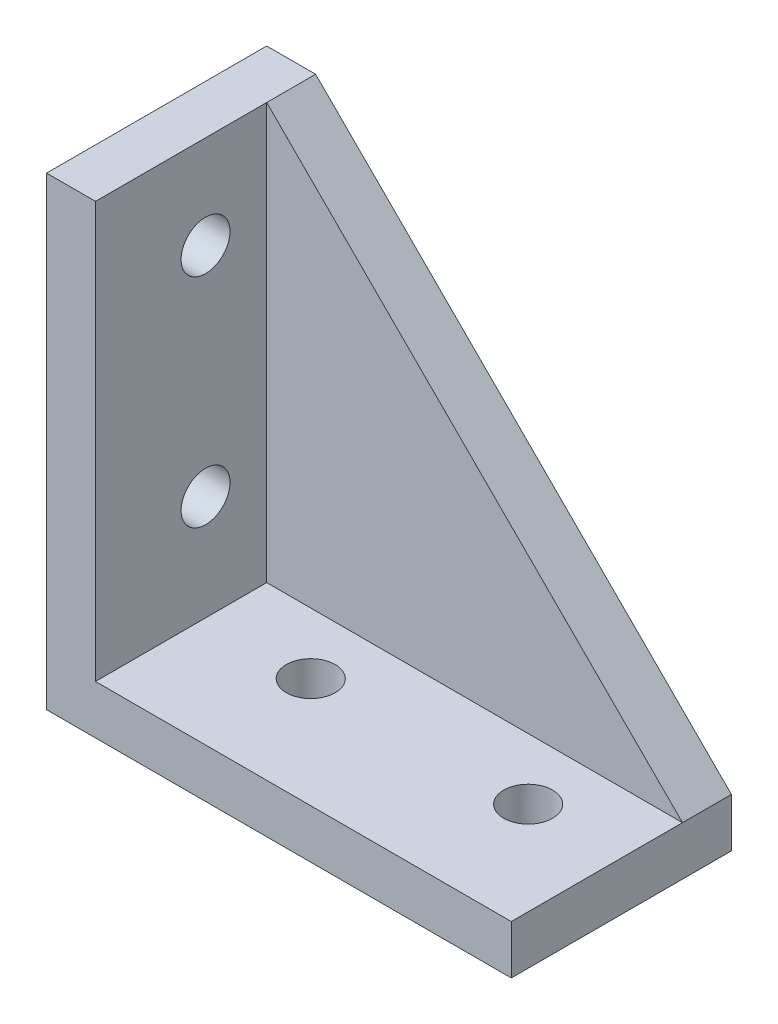
ISO-10303-21;
HEADER;
FILE_DESCRIPTION(('STEP AP214'),'2;1');
FILE_NAME('part.step','',(''),(''),'','','');
FILE_SCHEMA(('AUTOMOTIVE_DESIGN { 1 0 10303 214 1 1 1 1 }'));
ENDSEC;
DATA;
#1=APPLICATION_CONTEXT('core data for automotive mechanical design processes');
#2=APPLICATION_PROTOCOL_DEFINITION('international standard','automotive_design',2000,#1);
#3=PRODUCT_CONTEXT('',#1,'mechanical');
#4=PRODUCT('Part','Part','',(#3));
#5=PRODUCT_RELATED_PRODUCT_CATEGORY('part','',(#4));
#6=PRODUCT_DEFINITION_FORMATION('','',#4);
#7=PRODUCT_DEFINITION_CONTEXT('part definition',#1,'design');
#8=PRODUCT_DEFINITION('design','',#6,#7);
#9=PRODUCT_DEFINITION_SHAPE('','',#8);
#10=(LENGTH_UNIT() NAMED_UNIT(*) SI_UNIT(.MILLI.,.METRE.));
#11=(NAMED_UNIT(*) PLANE_ANGLE_UNIT() SI_UNIT($,.RADIAN.));
#12=(NAMED_UNIT(*) SI_UNIT($,.STERADIAN.) SOLID_ANGLE_UNIT());
#13=UNCERTAINTY_MEASURE_WITH_UNIT(LENGTH_MEASURE(1.E-05),#10,'distance_accuracy_value','');
#14=(GEOMETRIC_REPRESENTATION_CONTEXT(3) GLOBAL_UNCERTAINTY_ASSIGNED_CONTEXT((#13)) GLOBAL_UNIT_ASSIGNED_CONTEXT((#10,
#11,#12)) REPRESENTATION_CONTEXT('',''));
#15=CARTESIAN_POINT('',(0.,0.,0.));
#16=DIRECTION('',(0.,0.,1.));
#17=DIRECTION('',(1.,0.,0.));
#18=AXIS2_PLACEMENT_3D('',#15,#16,#17);
#19=CARTESIAN_POINT('',(38.,0.,14.));
#20=DIRECTION('',(0.,1.,0.));
#21=DIRECTION('',(0.,0.,1.));
#22=AXIS2_PLACEMENT_3D('',#19,#20,#21);
#23=PLANE('',#22);
#24=CARTESIAN_POINT('',(12.6,-1.31494815036604E-13,5.));
#25=DIRECTION('',(0.,-1.,0.));
#26=DIRECTION('',(0.,0.,-1.));
#27=AXIS2_PLACEMENT_3D('',#24,#25,#26);
#28=CIRCLE('',#27,2.);
#29=CARTESIAN_POINT('',(12.6,-1.31494815036604E-13,3.));
#30=VERTEX_POINT('',#29);
#31=EDGE_CURVE('E249',#30,#30,#28,.F.);
#32=ORIENTED_EDGE('',*,*,#31,.T.);
#33=EDGE_LOOP('',(#32));
#34=FACE_BOUND('',#33,.T.);
#35=CARTESIAN_POINT('',(30.38,-3.17048609588255E-13,5.));
#36=DIRECTION('',(0.,-1.,0.));
#37=DIRECTION('',(0.,0.,-1.));
#38=AXIS2_PLACEMENT_3D('',#35,#36,#37);
#39=CIRCLE('',#38,2.);
#40=CARTESIAN_POINT('',(30.38,-3.17048609588255E-13,3.));
#41=VERTEX_POINT('',#40);
#42=EDGE_CURVE('E253',#41,#41,#39,.F.);
#43=ORIENTED_EDGE('',*,*,#42,.T.);
#44=EDGE_LOOP('',(#43));
#45=FACE_BOUND('',#44,.T.);
#46=DIRECTION('',(0.,0.,-1.));
#47=VECTOR('',#46,1.);
#48=CARTESIAN_POINT('',(0.,0.,14.));
#49=LINE('',#48,#47);
#50=CARTESIAN_POINT('',(0.,0.,14.));
#51=VERTEX_POINT('',#50);
#52=CARTESIAN_POINT('',(0.,0.,-4.));
#53=VERTEX_POINT('',#52);
#54=EDGE_CURVE('E158',#51,#53,#49,.T.);
#55=ORIENTED_EDGE('',*,*,#54,.T.);
#56=DIRECTION('',(-1.,0.,0.));
#57=VECTOR('',#56,1.);
#58=CARTESIAN_POINT('',(0.,0.,-4.));
#59=LINE('',#58,#57);
#60=CARTESIAN_POINT('',(38.,0.,-4.));
#61=VERTEX_POINT('',#60);
#62=EDGE_CURVE('E184',#61,#53,#59,.T.);
#63=ORIENTED_EDGE('',*,*,#62,.F.);
#64=DIRECTION('',(0.,0.,-1.));
#65=VECTOR('',#64,1.);
#66=CARTESIAN_POINT('',(38.,0.,14.));
#67=LINE('',#66,#65);
#68=CARTESIAN_POINT('',(38.,0.,14.));
#69=VERTEX_POINT('',#68);
#70=EDGE_CURVE('E11',#69,#61,#67,.T.);
#71=ORIENTED_EDGE('',*,*,#70,.F.);
#72=DIRECTION('',(1.,0.,0.));
#73=VECTOR('',#72,1.);
#74=CARTESIAN_POINT('',(38.,0.,14.));
#75=LINE('',#74,#73);
#76=EDGE_CURVE('E142',#51,#69,#75,.T.);
#77=ORIENTED_EDGE('',*,*,#76,.F.);
#78=EDGE_LOOP('',(#55,#63,#71,#77));
#79=FACE_BOUND('',#78,.T.);
#80=ADVANCED_FACE('F45',(#34,#45,#79),#23,.F.);
#81=CARTESIAN_POINT('',(38.,4.,14.));
#82=DIRECTION('',(-1.,0.,0.));
#83=DIRECTION('',(0.,-1.,0.));
#84=AXIS2_PLACEMENT_3D('',#81,#82,#83);
#85=PLANE('',#84);
#86=ORIENTED_EDGE('',*,*,#70,.T.);
#87=DIRECTION('',(0.,-1.,0.));
#88=VECTOR('',#87,1.);
#89=CARTESIAN_POINT('',(38.,0.,-4.));
#90=LINE('',#89,#88);
#91=CARTESIAN_POINT('',(38.,4.,-4.));
#92=VERTEX_POINT('',#91);
#93=EDGE_CURVE('E112',#92,#61,#90,.T.);
#94=ORIENTED_EDGE('',*,*,#93,.F.);
#95=DIRECTION('',(0.,0.,1.));
#96=VECTOR('',#95,1.);
#97=CARTESIAN_POINT('',(38.,4.,-4.));
#98=LINE('',#97,#96);
#99=CARTESIAN_POINT('',(38.,4.,0.));
#100=VERTEX_POINT('',#99);
#101=EDGE_CURVE('E107',#92,#100,#98,.T.);
#102=ORIENTED_EDGE('',*,*,#101,.T.);
#103=DIRECTION('',(0.,0.,-1.));
#104=VECTOR('',#103,1.);
#105=CARTESIAN_POINT('',(38.,4.,14.));
#106=LINE('',#105,#104);
#107=CARTESIAN_POINT('',(38.,4.,14.));
#108=VERTEX_POINT('',#107);
#109=EDGE_CURVE('E54',#108,#100,#106,.T.);
#110=ORIENTED_EDGE('',*,*,#109,.F.);
#111=DIRECTION('',(0.,1.,0.));
#112=VECTOR('',#111,1.);
#113=CARTESIAN_POINT('',(38.,4.,14.));
#114=LINE('',#113,#112);
#115=EDGE_CURVE('E145',#69,#108,#114,.T.);
#116=ORIENTED_EDGE('',*,*,#115,.F.);
#117=EDGE_LOOP('',(#86,#94,#102,#110,#116));
#118=FACE_BOUND('',#117,.T.);
#119=ADVANCED_FACE('F180',(#118),#85,.F.);
#120=CARTESIAN_POINT('',(4.,4.,14.));
#121=DIRECTION('',(0.,-1.,0.));
#122=DIRECTION('',(0.,0.,-1.));
#123=AXIS2_PLACEMENT_3D('',#120,#121,#122);
#124=PLANE('',#123);
#125=CARTESIAN_POINT('',(12.6,3.99999999999987,5.));
#126=DIRECTION('',(0.,-1.,0.));
#127=DIRECTION('',(1.,0.,0.));
#128=AXIS2_PLACEMENT_3D('',#125,#126,#127);
#129=CIRCLE('',#128,2.);
#130=CARTESIAN_POINT('',(14.6,3.99999999999985,5.));
#131=VERTEX_POINT('',#130);
#132=EDGE_CURVE('E257',#131,#131,#129,.T.);
#133=ORIENTED_EDGE('',*,*,#132,.T.);
#134=EDGE_LOOP('',(#133));
#135=FACE_BOUND('',#134,.T.);
#136=CARTESIAN_POINT('',(30.38,3.99999999999968,5.));
#137=DIRECTION('',(0.,-1.,0.));
#138=DIRECTION('',(1.,0.,0.));
#139=AXIS2_PLACEMENT_3D('',#136,#137,#138);
#140=CIRCLE('',#139,2.);
#141=CARTESIAN_POINT('',(32.38,3.99999999999966,5.));
#142=VERTEX_POINT('',#141);
#143=EDGE_CURVE('E208',#142,#142,#140,.T.);
#144=ORIENTED_EDGE('',*,*,#143,.T.);
#145=EDGE_LOOP('',(#144));
#146=FACE_BOUND('',#145,.T.);
#147=DIRECTION('',(-1.,0.,0.));
#148=VECTOR('',#147,1.);
#149=CARTESIAN_POINT('',(4.,4.,0.));
#150=LINE('',#149,#148);
#151=CARTESIAN_POINT('',(4.,4.,0.));
#152=VERTEX_POINT('',#151);
#153=EDGE_CURVE('E132',#100,#152,#150,.T.);
#154=ORIENTED_EDGE('',*,*,#153,.T.);
#155=DIRECTION('',(0.,0.,-1.));
#156=VECTOR('',#155,1.);
#157=CARTESIAN_POINT('',(4.,4.,14.));
#158=LINE('',#157,#156);
#159=CARTESIAN_POINT('',(4.,4.,14.));
#160=VERTEX_POINT('',#159);
#161=EDGE_CURVE('E169',#160,#152,#158,.T.);
#162=ORIENTED_EDGE('',*,*,#161,.F.);
#163=DIRECTION('',(-1.,0.,0.));
#164=VECTOR('',#163,1.);
#165=CARTESIAN_POINT('',(4.,4.,14.));
#166=LINE('',#165,#164);
#167=EDGE_CURVE('E148',#108,#160,#166,.T.);
#168=ORIENTED_EDGE('',*,*,#167,.F.);
#169=ORIENTED_EDGE('',*,*,#109,.T.);
#170=EDGE_LOOP('',(#154,#162,#168,#169));
#171=FACE_BOUND('',#170,.T.);
#172=ADVANCED_FACE('F177',(#135,#146,#171),#124,.F.);
#173=CARTESIAN_POINT('',(4.,38.,14.));
#174=DIRECTION('',(-1.,0.,0.));
#175=DIRECTION('',(0.,-1.,0.));
#176=AXIS2_PLACEMENT_3D('',#173,#174,#175);
#177=PLANE('',#176);
#178=CARTESIAN_POINT('',(4.,30.38,5.));
#179=DIRECTION('',(1.,0.,0.));
#180=DIRECTION('',(0.,1.,0.));
#181=AXIS2_PLACEMENT_3D('',#178,#179,#180);
#182=CIRCLE('',#181,2.);
#183=CARTESIAN_POINT('',(4.,32.38,5.));
#184=VERTEX_POINT('',#183);
#185=EDGE_CURVE('E194',#184,#184,#182,.T.);
#186=ORIENTED_EDGE('',*,*,#185,.F.);
#187=EDGE_LOOP('',(#186));
#188=FACE_BOUND('',#187,.T.);
#189=CARTESIAN_POINT('',(4.,12.6,5.));
#190=DIRECTION('',(1.,0.,0.));
#191=DIRECTION('',(0.,1.,0.));
#192=AXIS2_PLACEMENT_3D('',#189,#190,#191);
#193=CIRCLE('',#192,2.);
#194=CARTESIAN_POINT('',(4.,14.6,5.));
#195=VERTEX_POINT('',#194);
#196=EDGE_CURVE('E204',#195,#195,#193,.T.);
#197=ORIENTED_EDGE('',*,*,#196,.F.);
#198=EDGE_LOOP('',(#197));
#199=FACE_BOUND('',#198,.T.);
#200=DIRECTION('',(0.,1.,0.));
#201=VECTOR('',#200,1.);
#202=CARTESIAN_POINT('',(4.,38.,0.));
#203=LINE('',#202,#201);
#204=CARTESIAN_POINT('',(4.,38.,0.));
#205=VERTEX_POINT('',#204);
#206=EDGE_CURVE('E137',#152,#205,#203,.T.);
#207=ORIENTED_EDGE('',*,*,#206,.T.);
#208=DIRECTION('',(0.,0.,-1.));
#209=VECTOR('',#208,1.);
#210=CARTESIAN_POINT('',(4.,38.,14.));
#211=LINE('',#210,#209);
#212=CARTESIAN_POINT('',(4.,38.,14.));
#213=VERTEX_POINT('',#212);
#214=EDGE_CURVE('E130',#213,#205,#211,.T.);
#215=ORIENTED_EDGE('',*,*,#214,.F.);
#216=DIRECTION('',(0.,1.,0.));
#217=VECTOR('',#216,1.);
#218=CARTESIAN_POINT('',(4.,38.,14.));
#219=LINE('',#218,#217);
#220=EDGE_CURVE('E151',#160,#213,#219,.T.);
#221=ORIENTED_EDGE('',*,*,#220,.F.);
#222=ORIENTED_EDGE('',*,*,#161,.T.);
#223=EDGE_LOOP('',(#207,#215,#221,#222));
#224=FACE_BOUND('',#223,.T.);
#225=ADVANCED_FACE('F224',(#188,#199,#224),#177,.F.);
#226=CARTESIAN_POINT('',(0.,38.,14.));
#227=DIRECTION('',(0.,-1.,0.));
#228=DIRECTION('',(0.,0.,-1.));
#229=AXIS2_PLACEMENT_3D('',#226,#227,#228);
#230=PLANE('',#229);
#231=ORIENTED_EDGE('',*,*,#214,.T.);
#232=DIRECTION('',(0.,0.,1.));
#233=VECTOR('',#232,1.);
#234=CARTESIAN_POINT('',(4.,38.,-4.));
#235=LINE('',#234,#233);
#236=CARTESIAN_POINT('',(4.,38.,-4.));
#237=VERTEX_POINT('',#236);
#238=EDGE_CURVE('E104',#237,#205,#235,.T.);
#239=ORIENTED_EDGE('',*,*,#238,.F.);
#240=DIRECTION('',(1.,0.,0.));
#241=VECTOR('',#240,1.);
#242=CARTESIAN_POINT('',(0.,38.,-4.));
#243=LINE('',#242,#241);
#244=CARTESIAN_POINT('',(0.,38.,-4.));
#245=VERTEX_POINT('',#244);
#246=EDGE_CURVE('E113',#245,#237,#243,.T.);
#247=ORIENTED_EDGE('',*,*,#246,.F.);
#248=DIRECTION('',(0.,0.,-1.));
#249=VECTOR('',#248,1.);
#250=CARTESIAN_POINT('',(0.,38.,14.));
#251=LINE('',#250,#249);
#252=CARTESIAN_POINT('',(0.,38.,14.));
#253=VERTEX_POINT('',#252);
#254=EDGE_CURVE('E164',#253,#245,#251,.T.);
#255=ORIENTED_EDGE('',*,*,#254,.F.);
#256=DIRECTION('',(-1.,0.,0.));
#257=VECTOR('',#256,1.);
#258=CARTESIAN_POINT('',(0.,38.,14.));
#259=LINE('',#258,#257);
#260=EDGE_CURVE('E154',#213,#253,#259,.T.);
#261=ORIENTED_EDGE('',*,*,#260,.F.);
#262=EDGE_LOOP('',(#231,#239,#247,#255,#261));
#263=FACE_BOUND('',#262,.T.);
#264=ADVANCED_FACE('F127',(#263),#230,.F.);
#265=CARTESIAN_POINT('',(0.,0.,14.));
#266=DIRECTION('',(1.,0.,0.));
#267=DIRECTION('',(0.,0.,-1.));
#268=AXIS2_PLACEMENT_3D('',#265,#266,#267);
#269=PLANE('',#268);
#270=CARTESIAN_POINT('',(0.,30.38,5.));
#271=DIRECTION('',(1.,0.,0.));
#272=DIRECTION('',(0.,0.,-1.));
#273=AXIS2_PLACEMENT_3D('',#270,#271,#272);
#274=CIRCLE('',#273,2.);
#275=CARTESIAN_POINT('',(0.,30.38,3.));
#276=VERTEX_POINT('',#275);
#277=EDGE_CURVE('E191',#276,#276,#274,.F.);
#278=ORIENTED_EDGE('',*,*,#277,.F.);
#279=EDGE_LOOP('',(#278));
#280=FACE_BOUND('',#279,.T.);
#281=CARTESIAN_POINT('',(0.,12.6,5.));
#282=DIRECTION('',(1.,0.,0.));
#283=DIRECTION('',(0.,0.,-1.));
#284=AXIS2_PLACEMENT_3D('',#281,#282,#283);
#285=CIRCLE('',#284,2.);
#286=CARTESIAN_POINT('',(0.,12.6,3.));
#287=VERTEX_POINT('',#286);
#288=EDGE_CURVE('E200',#287,#287,#285,.F.);
#289=ORIENTED_EDGE('',*,*,#288,.F.);
#290=EDGE_LOOP('',(#289));
#291=FACE_BOUND('',#290,.T.);
#292=ORIENTED_EDGE('',*,*,#254,.T.);
#293=DIRECTION('',(0.,1.,0.));
#294=VECTOR('',#293,1.);
#295=CARTESIAN_POINT('',(0.,0.,-4.));
#296=LINE('',#295,#294);
#297=EDGE_CURVE('E120',#53,#245,#296,.T.);
#298=ORIENTED_EDGE('',*,*,#297,.F.);
#299=ORIENTED_EDGE('',*,*,#54,.F.);
#300=DIRECTION('',(0.,-1.,0.));
#301=VECTOR('',#300,1.);
#302=CARTESIAN_POINT('',(0.,0.,14.));
#303=LINE('',#302,#301);
#304=EDGE_CURVE('E61',#253,#51,#303,.T.);
#305=ORIENTED_EDGE('',*,*,#304,.F.);
#306=EDGE_LOOP('',(#292,#298,#299,#305));
#307=FACE_BOUND('',#306,.T.);
#308=ADVANCED_FACE('F216',(#280,#291,#307),#269,.F.);
#309=CARTESIAN_POINT('',(0.,0.,14.));
#310=DIRECTION('',(0.,0.,-1.));
#311=DIRECTION('',(-1.,0.,0.));
#312=AXIS2_PLACEMENT_3D('',#309,#310,#311);
#313=PLANE('',#312);
#314=ORIENTED_EDGE('',*,*,#76,.T.);
#315=ORIENTED_EDGE('',*,*,#115,.T.);
#316=ORIENTED_EDGE('',*,*,#167,.T.);
#317=ORIENTED_EDGE('',*,*,#220,.T.);
#318=ORIENTED_EDGE('',*,*,#260,.T.);
#319=ORIENTED_EDGE('',*,*,#304,.T.);
#320=EDGE_LOOP('',(#314,#315,#316,#317,#318,#319));
#321=FACE_BOUND('',#320,.T.);
#322=ADVANCED_FACE('F219',(#321),#313,.F.);
#323=CARTESIAN_POINT('',(21.,21.,-4.));
#324=DIRECTION('',(-0.707106781186547,-0.707106781186547,0.));
#325=DIRECTION('',(0.707106781186548,-0.707106781186548,0.));
#326=AXIS2_PLACEMENT_3D('',#323,#324,#325);
#327=PLANE('',#326);
#328=DIRECTION('',(0.707106781186548,-0.707106781186548,0.));
#329=VECTOR('',#328,1.);
#330=CARTESIAN_POINT('',(21.,21.,0.));
#331=LINE('',#330,#329);
#332=EDGE_CURVE('E124',#205,#100,#331,.T.);
#333=ORIENTED_EDGE('',*,*,#332,.T.);
#334=ORIENTED_EDGE('',*,*,#101,.F.);
#335=DIRECTION('',(0.707106781186548,-0.707106781186548,0.));
#336=VECTOR('',#335,1.);
#337=CARTESIAN_POINT('',(21.,21.,-4.));
#338=LINE('',#337,#336);
#339=EDGE_CURVE('E99',#237,#92,#338,.T.);
#340=ORIENTED_EDGE('',*,*,#339,.F.);
#341=ORIENTED_EDGE('',*,*,#238,.T.);
#342=EDGE_LOOP('',(#333,#334,#340,#341));
#343=FACE_BOUND('',#342,.T.);
#344=ADVANCED_FACE('F102',(#343),#327,.F.);
#345=CARTESIAN_POINT('',(0.,0.,-4.));
#346=DIRECTION('',(0.,0.,-1.));
#347=DIRECTION('',(-1.,0.,0.));
#348=AXIS2_PLACEMENT_3D('',#345,#346,#347);
#349=PLANE('',#348);
#350=ORIENTED_EDGE('',*,*,#246,.T.);
#351=ORIENTED_EDGE('',*,*,#339,.T.);
#352=ORIENTED_EDGE('',*,*,#93,.T.);
#353=ORIENTED_EDGE('',*,*,#62,.T.);
#354=ORIENTED_EDGE('',*,*,#297,.T.);
#355=EDGE_LOOP('',(#350,#351,#352,#353,#354));
#356=FACE_BOUND('',#355,.T.);
#357=ADVANCED_FACE('F117',(#356),#349,.T.);
#358=CARTESIAN_POINT('',(0.,0.,0.));
#359=DIRECTION('',(0.,0.,-1.));
#360=DIRECTION('',(-1.,0.,0.));
#361=AXIS2_PLACEMENT_3D('',#358,#359,#360);
#362=PLANE('',#361);
#363=ORIENTED_EDGE('',*,*,#206,.F.);
#364=ORIENTED_EDGE('',*,*,#153,.F.);
#365=ORIENTED_EDGE('',*,*,#332,.F.);
#366=EDGE_LOOP('',(#363,#364,#365));
#367=FACE_BOUND('',#366,.T.);
#368=ADVANCED_FACE('F227',(#367),#362,.F.);
#369=CARTESIAN_POINT('',(-5.65685424949239,12.6,5.));
#370=DIRECTION('',(1.,0.,0.));
#371=DIRECTION('',(0.,1.,0.));
#372=AXIS2_PLACEMENT_3D('',#369,#370,#371);
#373=CYLINDRICAL_SURFACE('',#372,2.);
#374=ORIENTED_EDGE('',*,*,#288,.T.);
#375=EDGE_LOOP('',(#374));
#376=FACE_BOUND('',#375,.T.);
#377=ORIENTED_EDGE('',*,*,#196,.T.);
#378=EDGE_LOOP('',(#377));
#379=FACE_BOUND('',#378,.T.);
#380=ADVANCED_FACE('F213',(#376,#379),#373,.F.);
#381=CARTESIAN_POINT('',(-5.65685424949239,30.38,5.));
#382=DIRECTION('',(1.,0.,0.));
#383=DIRECTION('',(0.,1.,0.));
#384=AXIS2_PLACEMENT_3D('',#381,#382,#383);
#385=CYLINDRICAL_SURFACE('',#384,2.);
#386=ORIENTED_EDGE('',*,*,#277,.T.);
#387=EDGE_LOOP('',(#386));
#388=FACE_BOUND('',#387,.T.);
#389=ORIENTED_EDGE('',*,*,#185,.T.);
#390=EDGE_LOOP('',(#389));
#391=FACE_BOUND('',#390,.T.);
#392=ADVANCED_FACE('F235',(#388,#391),#385,.F.);
#393=CARTESIAN_POINT('',(30.3799999999999,-5.65685424949271,5.));
#394=DIRECTION('',(0.,1.,0.));
#395=DIRECTION('',(1.,0.,0.));
#396=AXIS2_PLACEMENT_3D('',#393,#394,#395);
#397=CYLINDRICAL_SURFACE('',#396,2.);
#398=ORIENTED_EDGE('',*,*,#42,.F.);
#399=EDGE_LOOP('',(#398));
#400=FACE_BOUND('',#399,.T.);
#401=ORIENTED_EDGE('',*,*,#143,.F.);
#402=EDGE_LOOP('',(#401));
#403=FACE_BOUND('',#402,.T.);
#404=ADVANCED_FACE('F272',(#400,#403),#397,.F.);
#405=CARTESIAN_POINT('',(12.5999999999999,-5.65685424949252,5.));
#406=DIRECTION('',(0.,1.,0.));
#407=DIRECTION('',(1.,0.,0.));
#408=AXIS2_PLACEMENT_3D('',#405,#406,#407);
#409=CYLINDRICAL_SURFACE('',#408,2.);
#410=ORIENTED_EDGE('',*,*,#31,.F.);
#411=EDGE_LOOP('',(#410));
#412=FACE_BOUND('',#411,.T.);
#413=ORIENTED_EDGE('',*,*,#132,.F.);
#414=EDGE_LOOP('',(#413));
#415=FACE_BOUND('',#414,.T.);
#416=ADVANCED_FACE('F270',(#412,#415),#409,.F.);
#417=CLOSED_SHELL('',(#80,#119,#172,#225,#264,#308,#322,#344,#357,#368,#380,#392,#404,#416));
#418=MANIFOLD_SOLID_BREP('B2',#417);
#419=ADVANCED_BREP_SHAPE_REPRESENTATION('',(#18,#418),#14);
#420=SHAPE_DEFINITION_REPRESENTATION(#9,#419);
ENDSEC;
END-ISO-10303-21;
